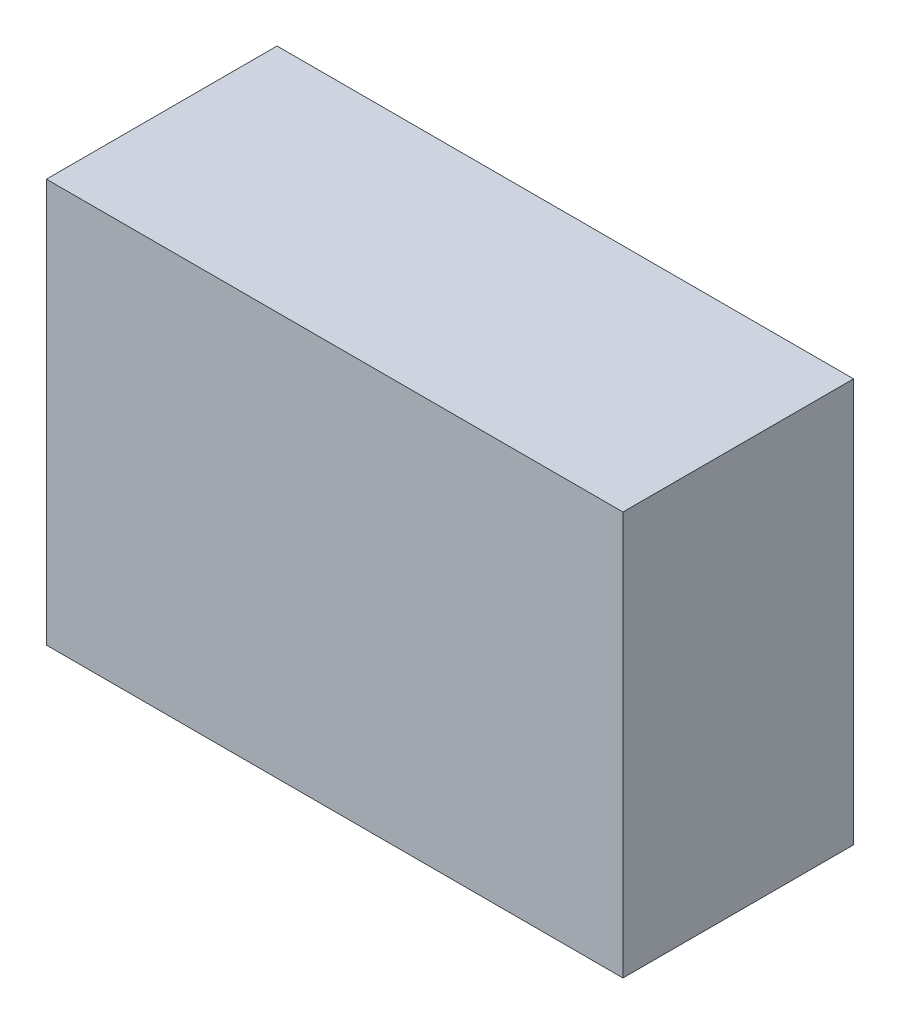
ISO-10303-21;
HEADER;
FILE_DESCRIPTION(('STEP AP214'),'2;1');
FILE_NAME('part.step','',(''),(''),'','','');
FILE_SCHEMA(('AUTOMOTIVE_DESIGN { 1 0 10303 214 1 1 1 1 }'));
ENDSEC;
DATA;
#1=APPLICATION_CONTEXT('core data for automotive mechanical design processes');
#2=APPLICATION_PROTOCOL_DEFINITION('international standard','automotive_design',2000,#1);
#3=PRODUCT_CONTEXT('',#1,'mechanical');
#4=PRODUCT('Part','Part','',(#3));
#5=PRODUCT_RELATED_PRODUCT_CATEGORY('part','',(#4));
#6=PRODUCT_DEFINITION_FORMATION('','',#4);
#7=PRODUCT_DEFINITION_CONTEXT('part definition',#1,'design');
#8=PRODUCT_DEFINITION('design','',#6,#7);
#9=PRODUCT_DEFINITION_SHAPE('','',#8);
#10=(LENGTH_UNIT() NAMED_UNIT(*) SI_UNIT(.MILLI.,.METRE.));
#11=(NAMED_UNIT(*) PLANE_ANGLE_UNIT() SI_UNIT($,.RADIAN.));
#12=(NAMED_UNIT(*) SI_UNIT($,.STERADIAN.) SOLID_ANGLE_UNIT());
#13=UNCERTAINTY_MEASURE_WITH_UNIT(LENGTH_MEASURE(1.E-05),#10,'distance_accuracy_value','');
#14=(GEOMETRIC_REPRESENTATION_CONTEXT(3) GLOBAL_UNCERTAINTY_ASSIGNED_CONTEXT((#13)) GLOBAL_UNIT_ASSIGNED_CONTEXT((#10,
#11,#12)) REPRESENTATION_CONTEXT('',''));
#15=CARTESIAN_POINT('',(0.,0.,0.));
#16=DIRECTION('',(0.,0.,1.));
#17=DIRECTION('',(1.,0.,0.));
#18=AXIS2_PLACEMENT_3D('',#15,#16,#17);
#19=CARTESIAN_POINT('',(300.,-35.,-80.));
#20=DIRECTION('',(0.,0.,1.));
#21=DIRECTION('',(1.,0.,0.));
#22=AXIS2_PLACEMENT_3D('',#19,#20,#21);
#23=PLANE('',#22);
#24=DIRECTION('',(0.,1.,0.));
#25=VECTOR('',#24,1.);
#26=CARTESIAN_POINT('',(300.,-35.,-80.));
#27=LINE('',#26,#25);
#28=CARTESIAN_POINT('',(300.,-35.,-80.));
#29=VERTEX_POINT('',#28);
#30=CARTESIAN_POINT('',(300.,35.,-80.));
#31=VERTEX_POINT('',#30);
#32=EDGE_CURVE('E89',#29,#31,#27,.T.);
#33=ORIENTED_EDGE('',*,*,#32,.F.);
#34=DIRECTION('',(1.,0.,0.));
#35=VECTOR('',#34,1.);
#36=CARTESIAN_POINT('',(300.,-35.,-80.));
#37=LINE('',#36,#35);
#38=CARTESIAN_POINT('',(400.,-35.,-80.));
#39=VERTEX_POINT('',#38);
#40=EDGE_CURVE('E49',#29,#39,#37,.T.);
#41=ORIENTED_EDGE('',*,*,#40,.T.);
#42=DIRECTION('',(0.,1.,0.));
#43=VECTOR('',#42,1.);
#44=CARTESIAN_POINT('',(400.,-35.,-80.));
#45=LINE('',#44,#43);
#46=CARTESIAN_POINT('',(400.,35.,-80.));
#47=VERTEX_POINT('',#46);
#48=EDGE_CURVE('E83',#39,#47,#45,.T.);
#49=ORIENTED_EDGE('',*,*,#48,.T.);
#50=DIRECTION('',(1.,0.,0.));
#51=VECTOR('',#50,1.);
#52=CARTESIAN_POINT('',(300.,35.,-80.));
#53=LINE('',#52,#51);
#54=EDGE_CURVE('E10',#31,#47,#53,.T.);
#55=ORIENTED_EDGE('',*,*,#54,.F.);
#56=EDGE_LOOP('',(#33,#41,#49,#55));
#57=FACE_BOUND('',#56,.T.);
#58=ADVANCED_FACE('F16',(#57),#23,.T.);
#59=CARTESIAN_POINT('',(300.,-35.,-120.));
#60=DIRECTION('',(0.,0.,1.));
#61=DIRECTION('',(1.,0.,0.));
#62=AXIS2_PLACEMENT_3D('',#59,#60,#61);
#63=PLANE('',#62);
#64=DIRECTION('',(1.,0.,0.));
#65=VECTOR('',#64,1.);
#66=CARTESIAN_POINT('',(300.,35.,-120.));
#67=LINE('',#66,#65);
#68=CARTESIAN_POINT('',(300.,35.,-120.));
#69=VERTEX_POINT('',#68);
#70=CARTESIAN_POINT('',(400.,35.,-120.));
#71=VERTEX_POINT('',#70);
#72=EDGE_CURVE('E26',#69,#71,#67,.T.);
#73=ORIENTED_EDGE('',*,*,#72,.T.);
#74=DIRECTION('',(0.,1.,0.));
#75=VECTOR('',#74,1.);
#76=CARTESIAN_POINT('',(400.,-35.,-120.));
#77=LINE('',#76,#75);
#78=CARTESIAN_POINT('',(400.,-35.,-120.));
#79=VERTEX_POINT('',#78);
#80=EDGE_CURVE('E106',#79,#71,#77,.T.);
#81=ORIENTED_EDGE('',*,*,#80,.F.);
#82=DIRECTION('',(1.,0.,0.));
#83=VECTOR('',#82,1.);
#84=CARTESIAN_POINT('',(300.,-35.,-120.));
#85=LINE('',#84,#83);
#86=CARTESIAN_POINT('',(300.,-35.,-120.));
#87=VERTEX_POINT('',#86);
#88=EDGE_CURVE('E59',#87,#79,#85,.T.);
#89=ORIENTED_EDGE('',*,*,#88,.F.);
#90=DIRECTION('',(0.,1.,0.));
#91=VECTOR('',#90,1.);
#92=CARTESIAN_POINT('',(300.,-35.,-120.));
#93=LINE('',#92,#91);
#94=EDGE_CURVE('E90',#87,#69,#93,.T.);
#95=ORIENTED_EDGE('',*,*,#94,.T.);
#96=EDGE_LOOP('',(#73,#81,#89,#95));
#97=FACE_BOUND('',#96,.T.);
#98=ADVANCED_FACE('F18',(#97),#63,.F.);
#99=CARTESIAN_POINT('',(300.,35.,-120.));
#100=DIRECTION('',(0.,1.,0.));
#101=DIRECTION('',(1.,0.,0.));
#102=AXIS2_PLACEMENT_3D('',#99,#100,#101);
#103=PLANE('',#102);
#104=ORIENTED_EDGE('',*,*,#72,.F.);
#105=DIRECTION('',(0.,0.,1.));
#106=VECTOR('',#105,1.);
#107=CARTESIAN_POINT('',(300.,35.,-120.));
#108=LINE('',#107,#106);
#109=EDGE_CURVE('E94',#69,#31,#108,.T.);
#110=ORIENTED_EDGE('',*,*,#109,.T.);
#111=ORIENTED_EDGE('',*,*,#54,.T.);
#112=DIRECTION('',(0.,0.,1.));
#113=VECTOR('',#112,1.);
#114=CARTESIAN_POINT('',(400.,35.,-120.));
#115=LINE('',#114,#113);
#116=EDGE_CURVE('E110',#71,#47,#115,.T.);
#117=ORIENTED_EDGE('',*,*,#116,.F.);
#118=EDGE_LOOP('',(#104,#110,#111,#117));
#119=FACE_BOUND('',#118,.T.);
#120=ADVANCED_FACE('F117',(#119),#103,.T.);
#121=CARTESIAN_POINT('',(300.,-35.,-120.));
#122=DIRECTION('',(0.,1.,0.));
#123=DIRECTION('',(1.,0.,0.));
#124=AXIS2_PLACEMENT_3D('',#121,#122,#123);
#125=PLANE('',#124);
#126=DIRECTION('',(0.,0.,1.));
#127=VECTOR('',#126,1.);
#128=CARTESIAN_POINT('',(400.,-35.,-120.));
#129=LINE('',#128,#127);
#130=EDGE_CURVE('E81',#79,#39,#129,.T.);
#131=ORIENTED_EDGE('',*,*,#130,.T.);
#132=ORIENTED_EDGE('',*,*,#40,.F.);
#133=DIRECTION('',(0.,0.,1.));
#134=VECTOR('',#133,1.);
#135=CARTESIAN_POINT('',(300.,-35.,-120.));
#136=LINE('',#135,#134);
#137=EDGE_CURVE('E78',#87,#29,#136,.T.);
#138=ORIENTED_EDGE('',*,*,#137,.F.);
#139=ORIENTED_EDGE('',*,*,#88,.T.);
#140=EDGE_LOOP('',(#131,#132,#138,#139));
#141=FACE_BOUND('',#140,.T.);
#142=ADVANCED_FACE('F77',(#141),#125,.F.);
#143=CARTESIAN_POINT('',(400.,-35.,-120.));
#144=DIRECTION('',(1.,0.,0.));
#145=DIRECTION('',(0.,1.,0.));
#146=AXIS2_PLACEMENT_3D('',#143,#144,#145);
#147=PLANE('',#146);
#148=ORIENTED_EDGE('',*,*,#130,.F.);
#149=ORIENTED_EDGE('',*,*,#80,.T.);
#150=ORIENTED_EDGE('',*,*,#116,.T.);
#151=ORIENTED_EDGE('',*,*,#48,.F.);
#152=EDGE_LOOP('',(#148,#149,#150,#151));
#153=FACE_BOUND('',#152,.T.);
#154=ADVANCED_FACE('F119',(#153),#147,.T.);
#155=CARTESIAN_POINT('',(300.,-35.,-120.));
#156=DIRECTION('',(1.,0.,0.));
#157=DIRECTION('',(0.,1.,0.));
#158=AXIS2_PLACEMENT_3D('',#155,#156,#157);
#159=PLANE('',#158);
#160=ORIENTED_EDGE('',*,*,#32,.T.);
#161=ORIENTED_EDGE('',*,*,#109,.F.);
#162=ORIENTED_EDGE('',*,*,#94,.F.);
#163=ORIENTED_EDGE('',*,*,#137,.T.);
#164=EDGE_LOOP('',(#160,#161,#162,#163));
#165=FACE_BOUND('',#164,.T.);
#166=ADVANCED_FACE('F87',(#165),#159,.F.);
#167=CLOSED_SHELL('',(#58,#98,#120,#142,#154,#166));
#168=MANIFOLD_SOLID_BREP('B1',#167);
#169=ADVANCED_BREP_SHAPE_REPRESENTATION('',(#18,#168),#14);
#170=SHAPE_DEFINITION_REPRESENTATION(#9,#169);
ENDSEC;
END-ISO-10303-21;
